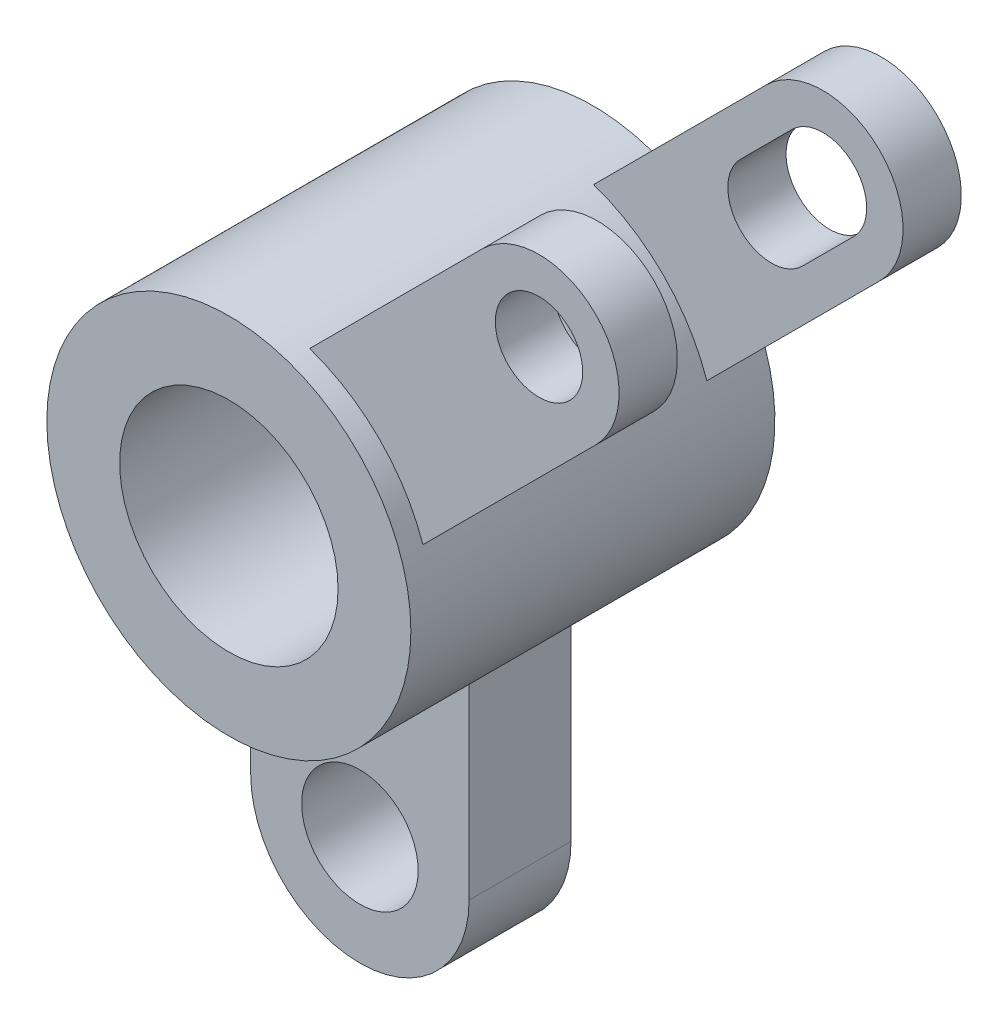
ISO-10303-21;
HEADER;
FILE_DESCRIPTION(('STEP AP214'),'2;1');
FILE_NAME('part.step','',(''),(''),'','','');
FILE_SCHEMA(('AUTOMOTIVE_DESIGN { 1 0 10303 214 1 1 1 1 }'));
ENDSEC;
DATA;
#1=APPLICATION_CONTEXT('core data for automotive mechanical design processes');
#2=APPLICATION_PROTOCOL_DEFINITION('international standard','automotive_design',2000,#1);
#3=PRODUCT_CONTEXT('',#1,'mechanical');
#4=PRODUCT('Part','Part','',(#3));
#5=PRODUCT_RELATED_PRODUCT_CATEGORY('part','',(#4));
#6=PRODUCT_DEFINITION_FORMATION('','',#4);
#7=PRODUCT_DEFINITION_CONTEXT('part definition',#1,'design');
#8=PRODUCT_DEFINITION('design','',#6,#7);
#9=PRODUCT_DEFINITION_SHAPE('','',#8);
#10=(LENGTH_UNIT() NAMED_UNIT(*) SI_UNIT(.MILLI.,.METRE.));
#11=(NAMED_UNIT(*) PLANE_ANGLE_UNIT() SI_UNIT($,.RADIAN.));
#12=(NAMED_UNIT(*) SI_UNIT($,.STERADIAN.) SOLID_ANGLE_UNIT());
#13=UNCERTAINTY_MEASURE_WITH_UNIT(LENGTH_MEASURE(1.E-05),#10,'distance_accuracy_value','');
#14=(GEOMETRIC_REPRESENTATION_CONTEXT(3) GLOBAL_UNCERTAINTY_ASSIGNED_CONTEXT((#13)) GLOBAL_UNIT_ASSIGNED_CONTEXT((#10,
#11,#12)) REPRESENTATION_CONTEXT('',''));
#15=CARTESIAN_POINT('',(0.,0.,0.));
#16=DIRECTION('',(0.,0.,1.));
#17=DIRECTION('',(1.,0.,0.));
#18=AXIS2_PLACEMENT_3D('',#15,#16,#17);
#19=CARTESIAN_POINT('',(0.,0.,25.));
#20=DIRECTION('',(0.,0.,-1.));
#21=DIRECTION('',(-1.,0.,0.));
#22=AXIS2_PLACEMENT_3D('',#19,#20,#21);
#23=CYLINDRICAL_SURFACE('',#22,12.5);
#24=DIRECTION('',(0.,0.,-1.));
#25=VECTOR('',#24,1.);
#26=CARTESIAN_POINT('',(-7.5,-10.,16.));
#27=LINE('',#26,#25);
#28=CARTESIAN_POINT('',(-7.5,-10.,16.));
#29=VERTEX_POINT('',#28);
#30=CARTESIAN_POINT('',(-7.5,-10.,9.));
#31=VERTEX_POINT('',#30);
#32=EDGE_CURVE('E54',#29,#31,#27,.T.);
#33=ORIENTED_EDGE('',*,*,#32,.F.);
#34=CARTESIAN_POINT('',(0.,0.,16.));
#35=DIRECTION('',(0.,0.,1.));
#36=DIRECTION('',(1.,0.,0.));
#37=AXIS2_PLACEMENT_3D('',#34,#35,#36);
#38=CIRCLE('',#37,12.5);
#39=CARTESIAN_POINT('',(7.49999999999999,-10.,16.));
#40=VERTEX_POINT('',#39);
#41=EDGE_CURVE('E11',#29,#40,#38,.T.);
#42=ORIENTED_EDGE('',*,*,#41,.T.);
#43=DIRECTION('',(0.,0.,-1.));
#44=VECTOR('',#43,1.);
#45=CARTESIAN_POINT('',(7.5,-10.,16.));
#46=LINE('',#45,#44);
#47=CARTESIAN_POINT('',(7.5,-10.,9.));
#48=VERTEX_POINT('',#47);
#49=EDGE_CURVE('E152',#40,#48,#46,.T.);
#50=ORIENTED_EDGE('',*,*,#49,.T.);
#51=CARTESIAN_POINT('',(0.,0.,9.));
#52=DIRECTION('',(0.,0.,1.));
#53=DIRECTION('',(1.,0.,0.));
#54=AXIS2_PLACEMENT_3D('',#51,#52,#53);
#55=CIRCLE('',#54,12.5);
#56=EDGE_CURVE('E44',#31,#48,#55,.T.);
#57=ORIENTED_EDGE('',*,*,#56,.F.);
#58=EDGE_LOOP('',(#33,#42,#50,#57));
#59=FACE_BOUND('',#58,.T.);
#60=DIRECTION('',(0.,0.,-1.));
#61=VECTOR('',#60,1.);
#62=CARTESIAN_POINT('',(11.8263412297198,4.04816663666776,4.));
#63=LINE('',#62,#61);
#64=CARTESIAN_POINT('',(11.8263412297198,4.04816663666776,4.));
#65=VERTEX_POINT('',#64);
#66=CARTESIAN_POINT('',(11.8263412297198,4.04816663666776,0.));
#67=VERTEX_POINT('',#66);
#68=EDGE_CURVE('E248',#65,#67,#63,.T.);
#69=ORIENTED_EDGE('',*,*,#68,.F.);
#70=CARTESIAN_POINT('',(0.,0.,4.));
#71=DIRECTION('',(0.,0.,1.));
#72=DIRECTION('',(1.,0.,0.));
#73=AXIS2_PLACEMENT_3D('',#70,#71,#72);
#74=CIRCLE('',#73,12.5);
#75=CARTESIAN_POINT('',(4.04816663666774,11.8263412297198,4.));
#76=VERTEX_POINT('',#75);
#77=EDGE_CURVE('E246',#65,#76,#74,.T.);
#78=ORIENTED_EDGE('',*,*,#77,.T.);
#79=DIRECTION('',(0.,0.,-1.));
#80=VECTOR('',#79,1.);
#81=CARTESIAN_POINT('',(4.04816663666774,11.8263412297198,4.));
#82=LINE('',#81,#80);
#83=CARTESIAN_POINT('',(4.04816663666774,11.8263412297198,0.));
#84=VERTEX_POINT('',#83);
#85=EDGE_CURVE('E261',#76,#84,#82,.T.);
#86=ORIENTED_EDGE('',*,*,#85,.T.);
#87=CARTESIAN_POINT('',(0.,0.,0.));
#88=DIRECTION('',(0.,0.,1.));
#89=DIRECTION('',(1.,0.,0.));
#90=AXIS2_PLACEMENT_3D('',#87,#88,#89);
#91=CIRCLE('',#90,12.5);
#92=EDGE_CURVE('E269',#84,#67,#91,.T.);
#93=ORIENTED_EDGE('',*,*,#92,.T.);
#94=EDGE_LOOP('',(#69,#78,#86,#93));
#95=FACE_BOUND('',#94,.T.);
#96=CARTESIAN_POINT('',(0.,0.,25.));
#97=DIRECTION('',(0.,0.,1.));
#98=DIRECTION('',(1.,0.,0.));
#99=AXIS2_PLACEMENT_3D('',#96,#97,#98);
#100=CIRCLE('',#99,12.5);
#101=CARTESIAN_POINT('',(12.5,0.,25.));
#102=VERTEX_POINT('',#101);
#103=EDGE_CURVE('E270',#102,#102,#100,.T.);
#104=ORIENTED_EDGE('',*,*,#103,.F.);
#105=EDGE_LOOP('',(#104));
#106=FACE_BOUND('',#105,.T.);
#107=CARTESIAN_POINT('',(0.,0.,19.5));
#108=DIRECTION('',(0.,0.,1.));
#109=DIRECTION('',(1.,0.,0.));
#110=AXIS2_PLACEMENT_3D('',#107,#108,#109);
#111=CIRCLE('',#110,12.5);
#112=CARTESIAN_POINT('',(11.8263412297198,4.04816663666776,19.5));
#113=VERTEX_POINT('',#112);
#114=CARTESIAN_POINT('',(4.04816663666774,11.8263412297198,19.5));
#115=VERTEX_POINT('',#114);
#116=EDGE_CURVE('E210',#113,#115,#111,.T.);
#117=ORIENTED_EDGE('',*,*,#116,.F.);
#118=DIRECTION('',(0.,0.,1.));
#119=VECTOR('',#118,1.);
#120=CARTESIAN_POINT('',(11.8263412297198,4.04816663666776,19.5));
#121=LINE('',#120,#119);
#122=CARTESIAN_POINT('',(11.8263412297198,4.04816663666776,23.5));
#123=VERTEX_POINT('',#122);
#124=EDGE_CURVE('E224',#113,#123,#121,.T.);
#125=ORIENTED_EDGE('',*,*,#124,.T.);
#126=CARTESIAN_POINT('',(0.,0.,23.5));
#127=DIRECTION('',(0.,0.,1.));
#128=DIRECTION('',(1.,0.,0.));
#129=AXIS2_PLACEMENT_3D('',#126,#127,#128);
#130=CIRCLE('',#129,12.5);
#131=CARTESIAN_POINT('',(4.04816663666774,11.8263412297198,23.5));
#132=VERTEX_POINT('',#131);
#133=EDGE_CURVE('E205',#123,#132,#130,.T.);
#134=ORIENTED_EDGE('',*,*,#133,.T.);
#135=DIRECTION('',(0.,0.,1.));
#136=VECTOR('',#135,1.);
#137=CARTESIAN_POINT('',(4.04816663666774,11.8263412297198,19.5));
#138=LINE('',#137,#136);
#139=EDGE_CURVE('E228',#115,#132,#138,.T.);
#140=ORIENTED_EDGE('',*,*,#139,.F.);
#141=EDGE_LOOP('',(#117,#125,#134,#140));
#142=FACE_BOUND('',#141,.T.);
#143=ADVANCED_FACE('F37',(#59,#95,#106,#142),#23,.T.);
#144=CARTESIAN_POINT('',(0.,0.,25.));
#145=DIRECTION('',(0.,0.,-1.));
#146=DIRECTION('',(-1.,0.,0.));
#147=AXIS2_PLACEMENT_3D('',#144,#145,#146);
#148=CYLINDRICAL_SURFACE('',#147,7.5);
#149=CARTESIAN_POINT('',(0.,0.,25.));
#150=DIRECTION('',(0.,0.,1.));
#151=DIRECTION('',(1.,0.,0.));
#152=AXIS2_PLACEMENT_3D('',#149,#150,#151);
#153=CIRCLE('',#152,7.5);
#154=CARTESIAN_POINT('',(7.5,0.,25.));
#155=VERTEX_POINT('',#154);
#156=EDGE_CURVE('E273',#155,#155,#153,.T.);
#157=ORIENTED_EDGE('',*,*,#156,.T.);
#158=EDGE_LOOP('',(#157));
#159=FACE_BOUND('',#158,.T.);
#160=CARTESIAN_POINT('',(0.,0.,0.));
#161=DIRECTION('',(0.,0.,1.));
#162=DIRECTION('',(1.,0.,0.));
#163=AXIS2_PLACEMENT_3D('',#160,#161,#162);
#164=CIRCLE('',#163,7.5);
#165=CARTESIAN_POINT('',(7.5,0.,0.));
#166=VERTEX_POINT('',#165);
#167=EDGE_CURVE('E274',#166,#166,#164,.T.);
#168=ORIENTED_EDGE('',*,*,#167,.F.);
#169=EDGE_LOOP('',(#168));
#170=FACE_BOUND('',#169,.T.);
#171=ADVANCED_FACE('F316',(#159,#170),#148,.F.);
#172=CARTESIAN_POINT('',(0.,0.,25.));
#173=DIRECTION('',(0.,0.,1.));
#174=DIRECTION('',(1.,0.,0.));
#175=AXIS2_PLACEMENT_3D('',#172,#173,#174);
#176=PLANE('',#175);
#177=ORIENTED_EDGE('',*,*,#103,.T.);
#178=EDGE_LOOP('',(#177));
#179=FACE_BOUND('',#178,.T.);
#180=ORIENTED_EDGE('',*,*,#156,.F.);
#181=EDGE_LOOP('',(#180));
#182=FACE_BOUND('',#181,.T.);
#183=ADVANCED_FACE('F320',(#179,#182),#176,.T.);
#184=CARTESIAN_POINT('',(0.,0.,0.));
#185=DIRECTION('',(0.,0.,1.));
#186=DIRECTION('',(1.,0.,0.));
#187=AXIS2_PLACEMENT_3D('',#184,#185,#186);
#188=PLANE('',#187);
#189=ORIENTED_EDGE('',*,*,#92,.F.);
#190=DIRECTION('',(0.707106781186546,0.707106781186549,0.));
#191=VECTOR('',#190,1.);
#192=CARTESIAN_POINT('',(-3.88908729652602,3.889087296526,0.));
#193=LINE('',#192,#191);
#194=CARTESIAN_POINT('',(15.9099025766973,23.6880771697494,0.));
#195=VERTEX_POINT('',#194);
#196=EDGE_CURVE('E238',#84,#195,#193,.T.);
#197=ORIENTED_EDGE('',*,*,#196,.T.);
#198=CARTESIAN_POINT('',(19.7989898732233,19.7989898732234,0.));
#199=DIRECTION('',(0.,0.,1.));
#200=DIRECTION('',(1.,0.,0.));
#201=AXIS2_PLACEMENT_3D('',#198,#199,#200);
#202=CIRCLE('',#201,5.50000000000003);
#203=CARTESIAN_POINT('',(23.6880771697493,15.9099025766973,0.));
#204=VERTEX_POINT('',#203);
#205=EDGE_CURVE('E254',#204,#195,#202,.T.);
#206=ORIENTED_EDGE('',*,*,#205,.F.);
#207=DIRECTION('',(0.707106781186548,0.707106781186547,0.));
#208=VECTOR('',#207,1.);
#209=CARTESIAN_POINT('',(3.88908729652601,-3.88908729652601,0.));
#210=LINE('',#209,#208);
#211=EDGE_CURVE('E251',#67,#204,#210,.T.);
#212=ORIENTED_EDGE('',*,*,#211,.F.);
#213=EDGE_LOOP('',(#189,#197,#206,#212));
#214=FACE_BOUND('',#213,.T.);
#215=ORIENTED_EDGE('',*,*,#167,.T.);
#216=EDGE_LOOP('',(#215));
#217=FACE_BOUND('',#216,.T.);
#218=CARTESIAN_POINT('',(16.2634559672906,16.2634559672906,0.));
#219=DIRECTION('',(0.,0.,-1.));
#220=DIRECTION('',(-1.,0.,0.));
#221=AXIS2_PLACEMENT_3D('',#218,#219,#220);
#222=CIRCLE('',#221,3.);
#223=CARTESIAN_POINT('',(18.3847763108502,14.142135623731,0.));
#224=VERTEX_POINT('',#223);
#225=CARTESIAN_POINT('',(14.142135623731,18.3847763108502,0.));
#226=VERTEX_POINT('',#225);
#227=EDGE_CURVE('E185',#224,#226,#222,.T.);
#228=ORIENTED_EDGE('',*,*,#227,.F.);
#229=DIRECTION('',(-0.707106781186548,-0.707106781186547,0.));
#230=VECTOR('',#229,1.);
#231=CARTESIAN_POINT('',(21.920310216783,17.6776695296637,0.));
#232=LINE('',#231,#230);
#233=CARTESIAN_POINT('',(21.920310216783,17.6776695296637,0.));
#234=VERTEX_POINT('',#233);
#235=EDGE_CURVE('E182',#234,#224,#232,.T.);
#236=ORIENTED_EDGE('',*,*,#235,.F.);
#237=CARTESIAN_POINT('',(19.7989898732233,19.7989898732233,0.));
#238=DIRECTION('',(0.,0.,1.));
#239=DIRECTION('',(1.,0.,0.));
#240=AXIS2_PLACEMENT_3D('',#237,#238,#239);
#241=CIRCLE('',#240,3.);
#242=CARTESIAN_POINT('',(17.6776695296637,21.920310216783,0.));
#243=VERTEX_POINT('',#242);
#244=EDGE_CURVE('E227',#234,#243,#241,.T.);
#245=ORIENTED_EDGE('',*,*,#244,.T.);
#246=DIRECTION('',(0.707106781186547,0.707106781186548,0.));
#247=VECTOR('',#246,1.);
#248=CARTESIAN_POINT('',(17.6776695296637,21.920310216783,0.));
#249=LINE('',#248,#247);
#250=EDGE_CURVE('E188',#226,#243,#249,.T.);
#251=ORIENTED_EDGE('',*,*,#250,.F.);
#252=EDGE_LOOP('',(#228,#236,#245,#251));
#253=FACE_BOUND('',#252,.T.);
#254=ADVANCED_FACE('F382',(#214,#217,#253),#188,.F.);
#255=CARTESIAN_POINT('',(3.88908729652601,-3.88908729652601,4.));
#256=DIRECTION('',(-0.707106781186547,0.707106781186548,0.));
#257=DIRECTION('',(-0.707106781186548,-0.707106781186547,0.));
#258=AXIS2_PLACEMENT_3D('',#255,#256,#257);
#259=PLANE('',#258);
#260=ORIENTED_EDGE('',*,*,#211,.T.);
#261=DIRECTION('',(0.,0.,-1.));
#262=VECTOR('',#261,1.);
#263=CARTESIAN_POINT('',(23.6880771697493,15.9099025766973,4.));
#264=LINE('',#263,#262);
#265=CARTESIAN_POINT('',(23.6880771697493,15.9099025766973,4.));
#266=VERTEX_POINT('',#265);
#267=EDGE_CURVE('E266',#266,#204,#264,.T.);
#268=ORIENTED_EDGE('',*,*,#267,.F.);
#269=DIRECTION('',(0.707106781186548,0.707106781186547,0.));
#270=VECTOR('',#269,1.);
#271=CARTESIAN_POINT('',(3.88908729652601,-3.88908729652601,4.));
#272=LINE('',#271,#270);
#273=EDGE_CURVE('E237',#65,#266,#272,.T.);
#274=ORIENTED_EDGE('',*,*,#273,.F.);
#275=ORIENTED_EDGE('',*,*,#68,.T.);
#276=EDGE_LOOP('',(#260,#268,#274,#275));
#277=FACE_BOUND('',#276,.T.);
#278=ADVANCED_FACE('F378',(#277),#259,.F.);
#279=CARTESIAN_POINT('',(19.7989898732233,19.7989898732234,4.));
#280=DIRECTION('',(0.,0.,-1.));
#281=DIRECTION('',(-1.,0.,0.));
#282=AXIS2_PLACEMENT_3D('',#279,#280,#281);
#283=CYLINDRICAL_SURFACE('',#282,5.50000000000003);
#284=ORIENTED_EDGE('',*,*,#205,.T.);
#285=DIRECTION('',(0.,0.,-1.));
#286=VECTOR('',#285,1.);
#287=CARTESIAN_POINT('',(15.9099025766973,23.6880771697494,4.));
#288=LINE('',#287,#286);
#289=CARTESIAN_POINT('',(15.9099025766973,23.6880771697494,4.));
#290=VERTEX_POINT('',#289);
#291=EDGE_CURVE('E264',#290,#195,#288,.T.);
#292=ORIENTED_EDGE('',*,*,#291,.F.);
#293=CARTESIAN_POINT('',(19.7989898732233,19.7989898732234,4.));
#294=DIRECTION('',(0.,0.,1.));
#295=DIRECTION('',(1.,0.,0.));
#296=AXIS2_PLACEMENT_3D('',#293,#294,#295);
#297=CIRCLE('',#296,5.50000000000003);
#298=EDGE_CURVE('E241',#266,#290,#297,.T.);
#299=ORIENTED_EDGE('',*,*,#298,.F.);
#300=ORIENTED_EDGE('',*,*,#267,.T.);
#301=EDGE_LOOP('',(#284,#292,#299,#300));
#302=FACE_BOUND('',#301,.T.);
#303=ADVANCED_FACE('F374',(#302),#283,.T.);
#304=CARTESIAN_POINT('',(-3.88908729652602,3.889087296526,4.));
#305=DIRECTION('',(-0.707106781186549,0.707106781186546,0.));
#306=DIRECTION('',(-0.707106781186546,-0.707106781186549,0.));
#307=AXIS2_PLACEMENT_3D('',#304,#305,#306);
#308=PLANE('',#307);
#309=ORIENTED_EDGE('',*,*,#196,.F.);
#310=ORIENTED_EDGE('',*,*,#85,.F.);
#311=DIRECTION('',(0.707106781186546,0.707106781186549,0.));
#312=VECTOR('',#311,1.);
#313=CARTESIAN_POINT('',(-3.88908729652602,3.889087296526,4.));
#314=LINE('',#313,#312);
#315=EDGE_CURVE('E243',#76,#290,#314,.T.);
#316=ORIENTED_EDGE('',*,*,#315,.T.);
#317=ORIENTED_EDGE('',*,*,#291,.T.);
#318=EDGE_LOOP('',(#309,#310,#316,#317));
#319=FACE_BOUND('',#318,.T.);
#320=ADVANCED_FACE('F371',(#319),#308,.T.);
#321=CARTESIAN_POINT('',(19.7989898732233,19.7989898732233,4.));
#322=DIRECTION('',(0.,0.,-1.));
#323=DIRECTION('',(-1.,0.,0.));
#324=AXIS2_PLACEMENT_3D('',#321,#322,#323);
#325=CYLINDRICAL_SURFACE('',#324,3.);
#326=DIRECTION('',(0.,0.,-1.));
#327=VECTOR('',#326,1.);
#328=CARTESIAN_POINT('',(21.920310216783,17.6776695296637,4.));
#329=LINE('',#328,#327);
#330=CARTESIAN_POINT('',(21.920310216783,17.6776695296637,4.));
#331=VERTEX_POINT('',#330);
#332=EDGE_CURVE('E167',#234,#331,#329,.F.);
#333=ORIENTED_EDGE('',*,*,#332,.T.);
#334=CARTESIAN_POINT('',(19.7989898732233,19.7989898732233,4.));
#335=DIRECTION('',(0.,0.,1.));
#336=DIRECTION('',(1.,0.,0.));
#337=AXIS2_PLACEMENT_3D('',#334,#335,#336);
#338=CIRCLE('',#337,3.);
#339=CARTESIAN_POINT('',(17.6776695296637,21.920310216783,4.));
#340=VERTEX_POINT('',#339);
#341=EDGE_CURVE('E234',#331,#340,#338,.T.);
#342=ORIENTED_EDGE('',*,*,#341,.T.);
#343=DIRECTION('',(0.,0.,-1.));
#344=VECTOR('',#343,1.);
#345=CARTESIAN_POINT('',(17.6776695296637,21.920310216783,4.));
#346=LINE('',#345,#344);
#347=EDGE_CURVE('E170',#243,#340,#346,.F.);
#348=ORIENTED_EDGE('',*,*,#347,.F.);
#349=ORIENTED_EDGE('',*,*,#244,.F.);
#350=EDGE_LOOP('',(#333,#342,#348,#349));
#351=FACE_BOUND('',#350,.T.);
#352=ADVANCED_FACE('F369',(#351),#325,.F.);
#353=CARTESIAN_POINT('',(0.,0.,4.));
#354=DIRECTION('',(0.,0.,1.));
#355=DIRECTION('',(1.,0.,0.));
#356=AXIS2_PLACEMENT_3D('',#353,#354,#355);
#357=PLANE('',#356);
#358=DIRECTION('',(-0.707106781186548,-0.707106781186547,0.));
#359=VECTOR('',#358,1.);
#360=CARTESIAN_POINT('',(21.920310216783,17.6776695296637,4.));
#361=LINE('',#360,#359);
#362=CARTESIAN_POINT('',(18.3847763108502,14.142135623731,4.));
#363=VERTEX_POINT('',#362);
#364=EDGE_CURVE('E193',#331,#363,#361,.T.);
#365=ORIENTED_EDGE('',*,*,#364,.T.);
#366=CARTESIAN_POINT('',(16.2634559672906,16.2634559672906,4.));
#367=DIRECTION('',(0.,0.,1.));
#368=DIRECTION('',(1.,0.,0.));
#369=AXIS2_PLACEMENT_3D('',#366,#367,#368);
#370=CIRCLE('',#369,3.);
#371=CARTESIAN_POINT('',(14.142135623731,18.3847763108502,4.));
#372=VERTEX_POINT('',#371);
#373=EDGE_CURVE('E176',#363,#372,#370,.F.);
#374=ORIENTED_EDGE('',*,*,#373,.T.);
#375=DIRECTION('',(0.707106781186547,0.707106781186548,0.));
#376=VECTOR('',#375,1.);
#377=CARTESIAN_POINT('',(17.6776695296637,21.920310216783,4.));
#378=LINE('',#377,#376);
#379=EDGE_CURVE('E179',#372,#340,#378,.T.);
#380=ORIENTED_EDGE('',*,*,#379,.T.);
#381=ORIENTED_EDGE('',*,*,#341,.F.);
#382=EDGE_LOOP('',(#365,#374,#380,#381));
#383=FACE_BOUND('',#382,.T.);
#384=ORIENTED_EDGE('',*,*,#273,.T.);
#385=ORIENTED_EDGE('',*,*,#298,.T.);
#386=ORIENTED_EDGE('',*,*,#315,.F.);
#387=ORIENTED_EDGE('',*,*,#77,.F.);
#388=EDGE_LOOP('',(#384,#385,#386,#387));
#389=FACE_BOUND('',#388,.T.);
#390=ADVANCED_FACE('F366',(#383,#389),#357,.T.);
#391=CARTESIAN_POINT('',(11.8263412297198,4.04816663666776,19.5));
#392=DIRECTION('',(0.707106781186547,-0.707106781186548,0.));
#393=DIRECTION('',(0.707106781186548,0.707106781186547,0.));
#394=AXIS2_PLACEMENT_3D('',#391,#392,#393);
#395=PLANE('',#394);
#396=DIRECTION('',(0.707106781186548,0.707106781186547,0.));
#397=VECTOR('',#396,1.);
#398=CARTESIAN_POINT('',(11.8263412297198,4.04816663666776,23.5));
#399=LINE('',#398,#397);
#400=CARTESIAN_POINT('',(23.6880771697493,15.9099025766973,23.5));
#401=VERTEX_POINT('',#400);
#402=EDGE_CURVE('E213',#123,#401,#399,.T.);
#403=ORIENTED_EDGE('',*,*,#402,.F.);
#404=ORIENTED_EDGE('',*,*,#124,.F.);
#405=DIRECTION('',(0.707106781186548,0.707106781186547,0.));
#406=VECTOR('',#405,1.);
#407=CARTESIAN_POINT('',(11.8263412297198,4.04816663666776,19.5));
#408=LINE('',#407,#406);
#409=CARTESIAN_POINT('',(23.6880771697493,15.9099025766973,19.5));
#410=VERTEX_POINT('',#409);
#411=EDGE_CURVE('E201',#113,#410,#408,.T.);
#412=ORIENTED_EDGE('',*,*,#411,.T.);
#413=DIRECTION('',(0.,0.,1.));
#414=VECTOR('',#413,1.);
#415=CARTESIAN_POINT('',(23.6880771697493,15.9099025766973,19.5));
#416=LINE('',#415,#414);
#417=EDGE_CURVE('E212',#410,#401,#416,.T.);
#418=ORIENTED_EDGE('',*,*,#417,.T.);
#419=EDGE_LOOP('',(#403,#404,#412,#418));
#420=FACE_BOUND('',#419,.T.);
#421=ADVANCED_FACE('F342',(#420),#395,.T.);
#422=CARTESIAN_POINT('',(4.04816663666774,11.8263412297198,19.5));
#423=DIRECTION('',(0.707106781186549,-0.707106781186546,0.));
#424=DIRECTION('',(0.707106781186546,0.707106781186549,0.));
#425=AXIS2_PLACEMENT_3D('',#422,#423,#424);
#426=PLANE('',#425);
#427=DIRECTION('',(0.707106781186546,0.707106781186549,0.));
#428=VECTOR('',#427,1.);
#429=CARTESIAN_POINT('',(4.04816663666774,11.8263412297198,23.5));
#430=LINE('',#429,#428);
#431=CARTESIAN_POINT('',(15.9099025766973,23.6880771697494,23.5));
#432=VERTEX_POINT('',#431);
#433=EDGE_CURVE('E219',#132,#432,#430,.T.);
#434=ORIENTED_EDGE('',*,*,#433,.T.);
#435=DIRECTION('',(0.,0.,1.));
#436=VECTOR('',#435,1.);
#437=CARTESIAN_POINT('',(15.9099025766973,23.6880771697494,19.5));
#438=LINE('',#437,#436);
#439=CARTESIAN_POINT('',(15.9099025766973,23.6880771697494,19.5));
#440=VERTEX_POINT('',#439);
#441=EDGE_CURVE('E231',#440,#432,#438,.T.);
#442=ORIENTED_EDGE('',*,*,#441,.F.);
#443=DIRECTION('',(0.707106781186546,0.707106781186549,0.));
#444=VECTOR('',#443,1.);
#445=CARTESIAN_POINT('',(4.04816663666774,11.8263412297198,19.5));
#446=LINE('',#445,#444);
#447=EDGE_CURVE('E208',#115,#440,#446,.T.);
#448=ORIENTED_EDGE('',*,*,#447,.F.);
#449=ORIENTED_EDGE('',*,*,#139,.T.);
#450=EDGE_LOOP('',(#434,#442,#448,#449));
#451=FACE_BOUND('',#450,.T.);
#452=ADVANCED_FACE('F336',(#451),#426,.F.);
#453=CARTESIAN_POINT('',(19.7989898732233,19.7989898732234,19.5));
#454=DIRECTION('',(0.,0.,1.));
#455=DIRECTION('',(1.,0.,0.));
#456=AXIS2_PLACEMENT_3D('',#453,#454,#455);
#457=CYLINDRICAL_SURFACE('',#456,5.50000000000003);
#458=CARTESIAN_POINT('',(19.7989898732233,19.7989898732234,23.5));
#459=DIRECTION('',(0.,0.,1.));
#460=DIRECTION('',(1.,0.,0.));
#461=AXIS2_PLACEMENT_3D('',#458,#459,#460);
#462=CIRCLE('',#461,5.50000000000003);
#463=EDGE_CURVE('E216',#401,#432,#462,.T.);
#464=ORIENTED_EDGE('',*,*,#463,.F.);
#465=ORIENTED_EDGE('',*,*,#417,.F.);
#466=CARTESIAN_POINT('',(19.7989898732233,19.7989898732234,19.5));
#467=DIRECTION('',(0.,0.,1.));
#468=DIRECTION('',(1.,0.,0.));
#469=AXIS2_PLACEMENT_3D('',#466,#467,#468);
#470=CIRCLE('',#469,5.50000000000003);
#471=EDGE_CURVE('E204',#410,#440,#470,.T.);
#472=ORIENTED_EDGE('',*,*,#471,.T.);
#473=ORIENTED_EDGE('',*,*,#441,.T.);
#474=EDGE_LOOP('',(#464,#465,#472,#473));
#475=FACE_BOUND('',#474,.T.);
#476=ADVANCED_FACE('F339',(#475),#457,.T.);
#477=CARTESIAN_POINT('',(19.7989898732233,19.7989898732234,19.5));
#478=DIRECTION('',(0.,0.,1.));
#479=DIRECTION('',(1.,0.,0.));
#480=AXIS2_PLACEMENT_3D('',#477,#478,#479);
#481=PLANE('',#480);
#482=CARTESIAN_POINT('',(19.7989898732233,19.7989898732233,19.5));
#483=DIRECTION('',(0.,0.,-1.));
#484=DIRECTION('',(-1.,0.,0.));
#485=AXIS2_PLACEMENT_3D('',#482,#483,#484);
#486=CIRCLE('',#485,3.);
#487=CARTESIAN_POINT('',(16.7989898732233,19.7989898732233,19.5));
#488=VERTEX_POINT('',#487);
#489=EDGE_CURVE('E197',#488,#488,#486,.T.);
#490=ORIENTED_EDGE('',*,*,#489,.F.);
#491=EDGE_LOOP('',(#490));
#492=FACE_BOUND('',#491,.T.);
#493=ORIENTED_EDGE('',*,*,#411,.F.);
#494=ORIENTED_EDGE('',*,*,#116,.T.);
#495=ORIENTED_EDGE('',*,*,#447,.T.);
#496=ORIENTED_EDGE('',*,*,#471,.F.);
#497=EDGE_LOOP('',(#493,#494,#495,#496));
#498=FACE_BOUND('',#497,.T.);
#499=ADVANCED_FACE('F332',(#492,#498),#481,.F.);
#500=CARTESIAN_POINT('',(19.7989898732233,19.7989898732234,23.5));
#501=DIRECTION('',(0.,0.,1.));
#502=DIRECTION('',(1.,0.,0.));
#503=AXIS2_PLACEMENT_3D('',#500,#501,#502);
#504=PLANE('',#503);
#505=CARTESIAN_POINT('',(19.7989898732233,19.7989898732233,23.5));
#506=DIRECTION('',(0.,0.,1.));
#507=DIRECTION('',(1.,0.,0.));
#508=AXIS2_PLACEMENT_3D('',#505,#506,#507);
#509=CIRCLE('',#508,3.);
#510=CARTESIAN_POINT('',(22.7989898732233,19.7989898732233,23.5));
#511=VERTEX_POINT('',#510);
#512=EDGE_CURVE('E200',#511,#511,#509,.T.);
#513=ORIENTED_EDGE('',*,*,#512,.F.);
#514=EDGE_LOOP('',(#513));
#515=FACE_BOUND('',#514,.T.);
#516=ORIENTED_EDGE('',*,*,#402,.T.);
#517=ORIENTED_EDGE('',*,*,#463,.T.);
#518=ORIENTED_EDGE('',*,*,#433,.F.);
#519=ORIENTED_EDGE('',*,*,#133,.F.);
#520=EDGE_LOOP('',(#516,#517,#518,#519));
#521=FACE_BOUND('',#520,.T.);
#522=ADVANCED_FACE('F344',(#515,#521),#504,.T.);
#523=CARTESIAN_POINT('',(19.7989898732233,19.7989898732233,25.));
#524=DIRECTION('',(0.,0.,-1.));
#525=DIRECTION('',(-1.,0.,0.));
#526=AXIS2_PLACEMENT_3D('',#523,#524,#525);
#527=CYLINDRICAL_SURFACE('',#526,3.);
#528=ORIENTED_EDGE('',*,*,#512,.T.);
#529=EDGE_LOOP('',(#528));
#530=FACE_BOUND('',#529,.T.);
#531=ORIENTED_EDGE('',*,*,#489,.T.);
#532=EDGE_LOOP('',(#531));
#533=FACE_BOUND('',#532,.T.);
#534=ADVANCED_FACE('F346',(#530,#533),#527,.F.);
#535=CARTESIAN_POINT('',(21.920310216783,17.6776695296637,25.001));
#536=DIRECTION('',(0.707106781186547,-0.707106781186548,0.));
#537=DIRECTION('',(0.707106781186548,0.707106781186547,0.));
#538=AXIS2_PLACEMENT_3D('',#535,#536,#537);
#539=PLANE('',#538);
#540=ORIENTED_EDGE('',*,*,#332,.F.);
#541=ORIENTED_EDGE('',*,*,#235,.T.);
#542=DIRECTION('',(0.,0.,-1.));
#543=VECTOR('',#542,1.);
#544=CARTESIAN_POINT('',(18.3847763108502,14.142135623731,25.001));
#545=LINE('',#544,#543);
#546=EDGE_CURVE('E190',#363,#224,#545,.T.);
#547=ORIENTED_EDGE('',*,*,#546,.F.);
#548=ORIENTED_EDGE('',*,*,#364,.F.);
#549=EDGE_LOOP('',(#540,#541,#547,#548));
#550=FACE_BOUND('',#549,.T.);
#551=ADVANCED_FACE('F353',(#550),#539,.F.);
#552=CARTESIAN_POINT('',(16.2634559672906,16.2634559672906,25.001));
#553=DIRECTION('',(0.,0.,-1.));
#554=DIRECTION('',(-1.,0.,0.));
#555=AXIS2_PLACEMENT_3D('',#552,#553,#554);
#556=CYLINDRICAL_SURFACE('',#555,3.);
#557=ORIENTED_EDGE('',*,*,#546,.T.);
#558=ORIENTED_EDGE('',*,*,#227,.T.);
#559=DIRECTION('',(0.,0.,-1.));
#560=VECTOR('',#559,1.);
#561=CARTESIAN_POINT('',(14.142135623731,18.3847763108502,25.001));
#562=LINE('',#561,#560);
#563=EDGE_CURVE('E191',#372,#226,#562,.T.);
#564=ORIENTED_EDGE('',*,*,#563,.F.);
#565=ORIENTED_EDGE('',*,*,#373,.F.);
#566=EDGE_LOOP('',(#557,#558,#564,#565));
#567=FACE_BOUND('',#566,.T.);
#568=ADVANCED_FACE('F404',(#567),#556,.F.);
#569=CARTESIAN_POINT('',(17.6776695296637,21.920310216783,25.001));
#570=DIRECTION('',(-0.707106781186548,0.707106781186547,0.));
#571=DIRECTION('',(-0.707106781186547,-0.707106781186548,0.));
#572=AXIS2_PLACEMENT_3D('',#569,#570,#571);
#573=PLANE('',#572);
#574=ORIENTED_EDGE('',*,*,#563,.T.);
#575=ORIENTED_EDGE('',*,*,#250,.T.);
#576=ORIENTED_EDGE('',*,*,#347,.T.);
#577=ORIENTED_EDGE('',*,*,#379,.F.);
#578=EDGE_LOOP('',(#574,#575,#576,#577));
#579=FACE_BOUND('',#578,.T.);
#580=ADVANCED_FACE('F411',(#579),#573,.F.);
#581=CARTESIAN_POINT('',(0.,0.,16.));
#582=DIRECTION('',(0.,0.,1.));
#583=DIRECTION('',(1.,0.,0.));
#584=AXIS2_PLACEMENT_3D('',#581,#582,#583);
#585=PLANE('',#584);
#586=CARTESIAN_POINT('',(0.,-23.,16.));
#587=DIRECTION('',(0.,0.,1.));
#588=DIRECTION('',(1.,0.,0.));
#589=AXIS2_PLACEMENT_3D('',#586,#587,#588);
#590=CIRCLE('',#589,4.);
#591=CARTESIAN_POINT('',(4.,-23.,16.));
#592=VERTEX_POINT('',#591);
#593=EDGE_CURVE('E162',#592,#592,#590,.T.);
#594=ORIENTED_EDGE('',*,*,#593,.F.);
#595=EDGE_LOOP('',(#594));
#596=FACE_BOUND('',#595,.T.);
#597=ORIENTED_EDGE('',*,*,#41,.F.);
#598=DIRECTION('',(0.,1.,0.));
#599=VECTOR('',#598,1.);
#600=CARTESIAN_POINT('',(-7.5,0.,16.));
#601=LINE('',#600,#599);
#602=CARTESIAN_POINT('',(-7.5,-23.,16.));
#603=VERTEX_POINT('',#602);
#604=EDGE_CURVE('E154',#603,#29,#601,.T.);
#605=ORIENTED_EDGE('',*,*,#604,.F.);
#606=CARTESIAN_POINT('',(0.,-23.,16.));
#607=DIRECTION('',(0.,0.,1.));
#608=DIRECTION('',(1.,0.,0.));
#609=AXIS2_PLACEMENT_3D('',#606,#607,#608);
#610=CIRCLE('',#609,7.5);
#611=CARTESIAN_POINT('',(7.5,-23.,16.));
#612=VERTEX_POINT('',#611);
#613=EDGE_CURVE('E155',#603,#612,#610,.T.);
#614=ORIENTED_EDGE('',*,*,#613,.T.);
#615=DIRECTION('',(0.,1.,0.));
#616=VECTOR('',#615,1.);
#617=CARTESIAN_POINT('',(7.5,0.,16.));
#618=LINE('',#617,#616);
#619=EDGE_CURVE('E145',#612,#40,#618,.T.);
#620=ORIENTED_EDGE('',*,*,#619,.T.);
#621=EDGE_LOOP('',(#597,#605,#614,#620));
#622=FACE_BOUND('',#621,.T.);
#623=ADVANCED_FACE('F159',(#596,#622),#585,.T.);
#624=CARTESIAN_POINT('',(0.,0.,9.));
#625=DIRECTION('',(0.,0.,1.));
#626=DIRECTION('',(1.,0.,0.));
#627=AXIS2_PLACEMENT_3D('',#624,#625,#626);
#628=PLANE('',#627);
#629=CARTESIAN_POINT('',(0.,-23.,9.));
#630=DIRECTION('',(0.,0.,1.));
#631=DIRECTION('',(1.,0.,0.));
#632=AXIS2_PLACEMENT_3D('',#629,#630,#631);
#633=CIRCLE('',#632,4.);
#634=CARTESIAN_POINT('',(4.,-23.,9.));
#635=VERTEX_POINT('',#634);
#636=EDGE_CURVE('E290',#635,#635,#633,.T.);
#637=ORIENTED_EDGE('',*,*,#636,.T.);
#638=EDGE_LOOP('',(#637));
#639=FACE_BOUND('',#638,.T.);
#640=DIRECTION('',(0.,1.,0.));
#641=VECTOR('',#640,1.);
#642=CARTESIAN_POINT('',(-7.5,0.,9.));
#643=LINE('',#642,#641);
#644=CARTESIAN_POINT('',(-7.5,-23.,9.));
#645=VERTEX_POINT('',#644);
#646=EDGE_CURVE('E287',#645,#31,#643,.T.);
#647=ORIENTED_EDGE('',*,*,#646,.T.);
#648=ORIENTED_EDGE('',*,*,#56,.T.);
#649=DIRECTION('',(0.,1.,0.));
#650=VECTOR('',#649,1.);
#651=CARTESIAN_POINT('',(7.5,0.,9.));
#652=LINE('',#651,#650);
#653=CARTESIAN_POINT('',(7.5,-23.,9.));
#654=VERTEX_POINT('',#653);
#655=EDGE_CURVE('E285',#654,#48,#652,.T.);
#656=ORIENTED_EDGE('',*,*,#655,.F.);
#657=CARTESIAN_POINT('',(0.,-23.,9.));
#658=DIRECTION('',(0.,0.,1.));
#659=DIRECTION('',(1.,0.,0.));
#660=AXIS2_PLACEMENT_3D('',#657,#658,#659);
#661=CIRCLE('',#660,7.5);
#662=EDGE_CURVE('E166',#645,#654,#661,.T.);
#663=ORIENTED_EDGE('',*,*,#662,.F.);
#664=EDGE_LOOP('',(#647,#648,#656,#663));
#665=FACE_BOUND('',#664,.T.);
#666=ADVANCED_FACE('F284',(#639,#665),#628,.F.);
#667=CARTESIAN_POINT('',(0.,-23.,16.));
#668=DIRECTION('',(0.,0.,-1.));
#669=DIRECTION('',(-1.,0.,0.));
#670=AXIS2_PLACEMENT_3D('',#667,#668,#669);
#671=CYLINDRICAL_SURFACE('',#670,7.5);
#672=ORIENTED_EDGE('',*,*,#662,.T.);
#673=DIRECTION('',(0.,0.,-1.));
#674=VECTOR('',#673,1.);
#675=CARTESIAN_POINT('',(7.5,-23.,16.));
#676=LINE('',#675,#674);
#677=EDGE_CURVE('E150',#612,#654,#676,.T.);
#678=ORIENTED_EDGE('',*,*,#677,.F.);
#679=ORIENTED_EDGE('',*,*,#613,.F.);
#680=DIRECTION('',(0.,0.,-1.));
#681=VECTOR('',#680,1.);
#682=CARTESIAN_POINT('',(-7.5,-23.,16.));
#683=LINE('',#682,#681);
#684=EDGE_CURVE('E294',#603,#645,#683,.T.);
#685=ORIENTED_EDGE('',*,*,#684,.T.);
#686=EDGE_LOOP('',(#672,#678,#679,#685));
#687=FACE_BOUND('',#686,.T.);
#688=ADVANCED_FACE('F164',(#687),#671,.T.);
#689=CARTESIAN_POINT('',(7.5,0.,16.));
#690=DIRECTION('',(-1.,0.,0.));
#691=DIRECTION('',(0.,0.,1.));
#692=AXIS2_PLACEMENT_3D('',#689,#690,#691);
#693=PLANE('',#692);
#694=ORIENTED_EDGE('',*,*,#655,.T.);
#695=ORIENTED_EDGE('',*,*,#49,.F.);
#696=ORIENTED_EDGE('',*,*,#619,.F.);
#697=ORIENTED_EDGE('',*,*,#677,.T.);
#698=EDGE_LOOP('',(#694,#695,#696,#697));
#699=FACE_BOUND('',#698,.T.);
#700=ADVANCED_FACE('F148',(#699),#693,.F.);
#701=CARTESIAN_POINT('',(0.,-23.,16.));
#702=DIRECTION('',(0.,0.,-1.));
#703=DIRECTION('',(-1.,0.,0.));
#704=AXIS2_PLACEMENT_3D('',#701,#702,#703);
#705=CYLINDRICAL_SURFACE('',#704,4.);
#706=ORIENTED_EDGE('',*,*,#593,.T.);
#707=EDGE_LOOP('',(#706));
#708=FACE_BOUND('',#707,.T.);
#709=ORIENTED_EDGE('',*,*,#636,.F.);
#710=EDGE_LOOP('',(#709));
#711=FACE_BOUND('',#710,.T.);
#712=ADVANCED_FACE('F302',(#708,#711),#705,.F.);
#713=CARTESIAN_POINT('',(-7.5,0.,16.));
#714=DIRECTION('',(-1.,0.,0.));
#715=DIRECTION('',(0.,0.,1.));
#716=AXIS2_PLACEMENT_3D('',#713,#714,#715);
#717=PLANE('',#716);
#718=ORIENTED_EDGE('',*,*,#646,.F.);
#719=ORIENTED_EDGE('',*,*,#684,.F.);
#720=ORIENTED_EDGE('',*,*,#604,.T.);
#721=ORIENTED_EDGE('',*,*,#32,.T.);
#722=EDGE_LOOP('',(#718,#719,#720,#721));
#723=FACE_BOUND('',#722,.T.);
#724=ADVANCED_FACE('F296',(#723),#717,.T.);
#725=CLOSED_SHELL('',(#143,#171,#183,#254,#278,#303,#320,#352,#390,#421,#452,#476,#499,#522,
#534,#551,#568,#580,#623,#666,#688,#700,#712,#724));
#726=MANIFOLD_SOLID_BREP('B2',#725);
#727=ADVANCED_BREP_SHAPE_REPRESENTATION('',(#18,#726),#14);
#728=SHAPE_DEFINITION_REPRESENTATION(#9,#727);
ENDSEC;
END-ISO-10303-21;
